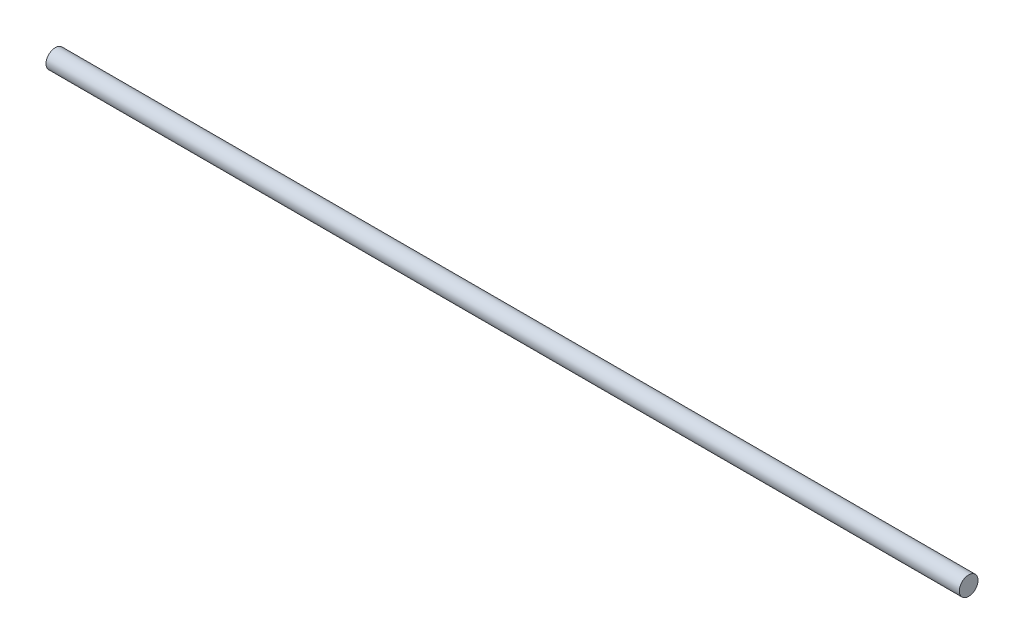
ISO-10303-21;
HEADER;
FILE_DESCRIPTION(('STEP AP214'),'2;1');
FILE_NAME('part.step','',(''),(''),'','','');
FILE_SCHEMA(('AUTOMOTIVE_DESIGN { 1 0 10303 214 1 1 1 1 }'));
ENDSEC;
DATA;
#1=APPLICATION_CONTEXT('core data for automotive mechanical design processes');
#2=APPLICATION_PROTOCOL_DEFINITION('international standard','automotive_design',2000,#1);
#3=PRODUCT_CONTEXT('',#1,'mechanical');
#4=PRODUCT('Part','Part','',(#3));
#5=PRODUCT_RELATED_PRODUCT_CATEGORY('part','',(#4));
#6=PRODUCT_DEFINITION_FORMATION('','',#4);
#7=PRODUCT_DEFINITION_CONTEXT('part definition',#1,'design');
#8=PRODUCT_DEFINITION('design','',#6,#7);
#9=PRODUCT_DEFINITION_SHAPE('','',#8);
#10=(LENGTH_UNIT() NAMED_UNIT(*) SI_UNIT(.MILLI.,.METRE.));
#11=(NAMED_UNIT(*) PLANE_ANGLE_UNIT() SI_UNIT($,.RADIAN.));
#12=(NAMED_UNIT(*) SI_UNIT($,.STERADIAN.) SOLID_ANGLE_UNIT());
#13=UNCERTAINTY_MEASURE_WITH_UNIT(LENGTH_MEASURE(1.E-05),#10,'distance_accuracy_value','');
#14=(GEOMETRIC_REPRESENTATION_CONTEXT(3) GLOBAL_UNCERTAINTY_ASSIGNED_CONTEXT((#13)) GLOBAL_UNIT_ASSIGNED_CONTEXT((#10,
#11,#12)) REPRESENTATION_CONTEXT('',''));
#15=CARTESIAN_POINT('',(0.,0.,0.));
#16=DIRECTION('',(0.,0.,1.));
#17=DIRECTION('',(1.,0.,0.));
#18=AXIS2_PLACEMENT_3D('',#15,#16,#17);
#19=CARTESIAN_POINT('',(-183.980256121069,15.,-160.000000000001));
#20=DIRECTION('',(1.,0.,0.));
#21=DIRECTION('',(0.,0.,1.));
#22=AXIS2_PLACEMENT_3D('',#19,#20,#21);
#23=CYLINDRICAL_SURFACE('',#22,3.175);
#24=CARTESIAN_POINT('',(-175.,15.,-160.000000000001));
#25=DIRECTION('',(1.,0.,0.));
#26=DIRECTION('',(0.,0.,-1.));
#27=AXIS2_PLACEMENT_3D('',#24,#25,#26);
#28=CIRCLE('',#27,3.175);
#29=CARTESIAN_POINT('',(-175.,15.,-163.175000000001));
#30=VERTEX_POINT('',#29);
#31=EDGE_CURVE('E10',#30,#30,#28,.T.);
#32=ORIENTED_EDGE('',*,*,#31,.T.);
#33=EDGE_LOOP('',(#32));
#34=FACE_BOUND('',#33,.T.);
#35=CARTESIAN_POINT('',(135.,15.,-160.));
#36=DIRECTION('',(-1.,0.,0.));
#37=DIRECTION('',(0.,0.,1.));
#38=AXIS2_PLACEMENT_3D('',#35,#36,#37);
#39=CIRCLE('',#38,3.175);
#40=CARTESIAN_POINT('',(135.,15.,-156.825));
#41=VERTEX_POINT('',#40);
#42=EDGE_CURVE('E37',#41,#41,#39,.F.);
#43=ORIENTED_EDGE('',*,*,#42,.F.);
#44=EDGE_LOOP('',(#43));
#45=FACE_BOUND('',#44,.T.);
#46=ADVANCED_FACE('F30',(#34,#45),#23,.T.);
#47=CARTESIAN_POINT('',(-175.,-3.18,-145.000000000001));
#48=DIRECTION('',(-1.,0.,0.));
#49=DIRECTION('',(0.,0.,-1.));
#50=AXIS2_PLACEMENT_3D('',#47,#48,#49);
#51=PLANE('',#50);
#52=ORIENTED_EDGE('',*,*,#31,.F.);
#53=EDGE_LOOP('',(#52));
#54=FACE_BOUND('',#53,.T.);
#55=ADVANCED_FACE('F32',(#54),#51,.T.);
#56=CARTESIAN_POINT('',(135.,25.,-145.));
#57=DIRECTION('',(1.,0.,0.));
#58=DIRECTION('',(0.,0.,1.));
#59=AXIS2_PLACEMENT_3D('',#56,#57,#58);
#60=PLANE('',#59);
#61=ORIENTED_EDGE('',*,*,#42,.T.);
#62=EDGE_LOOP('',(#61));
#63=FACE_BOUND('',#62,.T.);
#64=ADVANCED_FACE('F43',(#63),#60,.T.);
#65=CLOSED_SHELL('',(#46,#55,#64));
#66=MANIFOLD_SOLID_BREP('B2',#65);
#67=ADVANCED_BREP_SHAPE_REPRESENTATION('',(#18,#66),#14);
#68=SHAPE_DEFINITION_REPRESENTATION(#9,#67);
ENDSEC;
END-ISO-10303-21;
